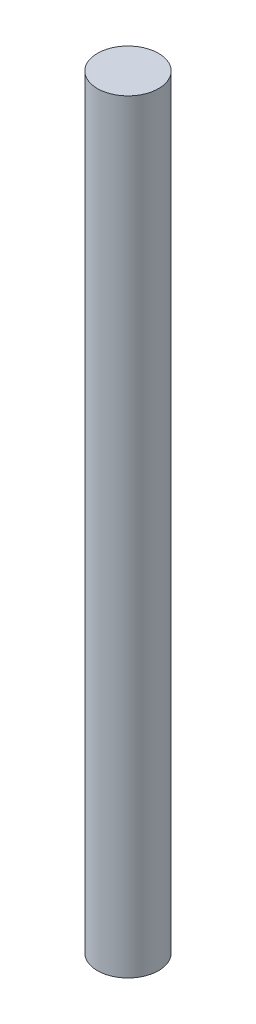
ISO-10303-21;
HEADER;
FILE_DESCRIPTION(('STEP AP214'),'2;1');
FILE_NAME('part.step','',(''),(''),'','','');
FILE_SCHEMA(('AUTOMOTIVE_DESIGN { 1 0 10303 214 1 1 1 1 }'));
ENDSEC;
DATA;
#1=APPLICATION_CONTEXT('core data for automotive mechanical design processes');
#2=APPLICATION_PROTOCOL_DEFINITION('international standard','automotive_design',2000,#1);
#3=PRODUCT_CONTEXT('',#1,'mechanical');
#4=PRODUCT('Part','Part','',(#3));
#5=PRODUCT_RELATED_PRODUCT_CATEGORY('part','',(#4));
#6=PRODUCT_DEFINITION_FORMATION('','',#4);
#7=PRODUCT_DEFINITION_CONTEXT('part definition',#1,'design');
#8=PRODUCT_DEFINITION('design','',#6,#7);
#9=PRODUCT_DEFINITION_SHAPE('','',#8);
#10=(LENGTH_UNIT() NAMED_UNIT(*) SI_UNIT(.MILLI.,.METRE.));
#11=(NAMED_UNIT(*) PLANE_ANGLE_UNIT() SI_UNIT($,.RADIAN.));
#12=(NAMED_UNIT(*) SI_UNIT($,.STERADIAN.) SOLID_ANGLE_UNIT());
#13=UNCERTAINTY_MEASURE_WITH_UNIT(LENGTH_MEASURE(1.E-05),#10,'distance_accuracy_value','');
#14=(GEOMETRIC_REPRESENTATION_CONTEXT(3) GLOBAL_UNCERTAINTY_ASSIGNED_CONTEXT((#13)) GLOBAL_UNIT_ASSIGNED_CONTEXT((#10,
#11,#12)) REPRESENTATION_CONTEXT('',''));
#15=CARTESIAN_POINT('',(0.,0.,0.));
#16=DIRECTION('',(0.,0.,1.));
#17=DIRECTION('',(1.,0.,0.));
#18=AXIS2_PLACEMENT_3D('',#15,#16,#17);
#19=CARTESIAN_POINT('',(0.,63.5,0.));
#20=DIRECTION('',(0.,-1.,0.));
#21=DIRECTION('',(0.,0.,-1.));
#22=AXIS2_PLACEMENT_3D('',#19,#20,#21);
#23=CYLINDRICAL_SURFACE('',#22,2.54);
#24=CARTESIAN_POINT('',(0.,63.5,0.));
#25=DIRECTION('',(0.,1.,0.));
#26=DIRECTION('',(0.,0.,1.));
#27=AXIS2_PLACEMENT_3D('',#24,#25,#26);
#28=CIRCLE('',#27,2.54);
#29=CARTESIAN_POINT('',(0.,63.5,2.54));
#30=VERTEX_POINT('',#29);
#31=EDGE_CURVE('E10',#30,#30,#28,.T.);
#32=ORIENTED_EDGE('',*,*,#31,.F.);
#33=EDGE_LOOP('',(#32));
#34=FACE_BOUND('',#33,.T.);
#35=CARTESIAN_POINT('',(0.,0.,0.));
#36=DIRECTION('',(0.,1.,0.));
#37=DIRECTION('',(0.,0.,1.));
#38=AXIS2_PLACEMENT_3D('',#35,#36,#37);
#39=CIRCLE('',#38,2.54);
#40=CARTESIAN_POINT('',(0.,0.,2.54));
#41=VERTEX_POINT('',#40);
#42=EDGE_CURVE('E40',#41,#41,#39,.T.);
#43=ORIENTED_EDGE('',*,*,#42,.T.);
#44=EDGE_LOOP('',(#43));
#45=FACE_BOUND('',#44,.T.);
#46=ADVANCED_FACE('F37',(#34,#45),#23,.T.);
#47=CARTESIAN_POINT('',(0.,63.5,0.));
#48=DIRECTION('',(0.,1.,0.));
#49=DIRECTION('',(0.,0.,1.));
#50=AXIS2_PLACEMENT_3D('',#47,#48,#49);
#51=PLANE('',#50);
#52=ORIENTED_EDGE('',*,*,#31,.T.);
#53=EDGE_LOOP('',(#52));
#54=FACE_BOUND('',#53,.T.);
#55=ADVANCED_FACE('F54',(#54),#51,.T.);
#56=CARTESIAN_POINT('',(0.,0.,0.));
#57=DIRECTION('',(0.,1.,0.));
#58=DIRECTION('',(0.,0.,1.));
#59=AXIS2_PLACEMENT_3D('',#56,#57,#58);
#60=PLANE('',#59);
#61=ORIENTED_EDGE('',*,*,#42,.F.);
#62=EDGE_LOOP('',(#61));
#63=FACE_BOUND('',#62,.T.);
#64=ADVANCED_FACE('F52',(#63),#60,.F.);
#65=CLOSED_SHELL('',(#46,#55,#64));
#66=MANIFOLD_SOLID_BREP('B2',#65);
#67=ADVANCED_BREP_SHAPE_REPRESENTATION('',(#18,#66),#14);
#68=SHAPE_DEFINITION_REPRESENTATION(#9,#67);
ENDSEC;
END-ISO-10303-21;
